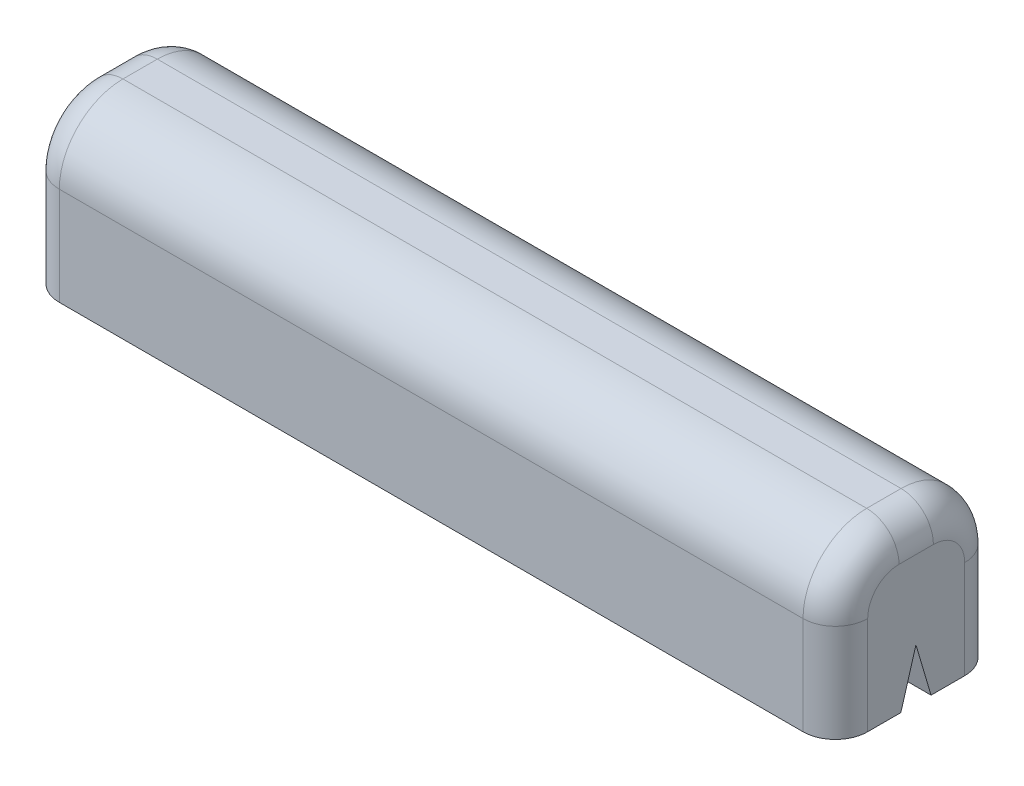
ISO-10303-21;
HEADER;
FILE_DESCRIPTION(('STEP AP214'),'2;1');
FILE_NAME('part.step','',(''),(''),'','','');
FILE_SCHEMA(('AUTOMOTIVE_DESIGN { 1 0 10303 214 1 1 1 1 }'));
ENDSEC;
DATA;
#1=APPLICATION_CONTEXT('core data for automotive mechanical design processes');
#2=APPLICATION_PROTOCOL_DEFINITION('international standard','automotive_design',2000,#1);
#3=PRODUCT_CONTEXT('',#1,'mechanical');
#4=PRODUCT('Part','Part','',(#3));
#5=PRODUCT_RELATED_PRODUCT_CATEGORY('part','',(#4));
#6=PRODUCT_DEFINITION_FORMATION('','',#4);
#7=PRODUCT_DEFINITION_CONTEXT('part definition',#1,'design');
#8=PRODUCT_DEFINITION('design','',#6,#7);
#9=PRODUCT_DEFINITION_SHAPE('','',#8);
#10=(LENGTH_UNIT() NAMED_UNIT(*) SI_UNIT(.MILLI.,.METRE.));
#11=(NAMED_UNIT(*) PLANE_ANGLE_UNIT() SI_UNIT($,.RADIAN.));
#12=(NAMED_UNIT(*) SI_UNIT($,.STERADIAN.) SOLID_ANGLE_UNIT());
#13=UNCERTAINTY_MEASURE_WITH_UNIT(LENGTH_MEASURE(1.E-05),#10,'distance_accuracy_value','');
#14=(GEOMETRIC_REPRESENTATION_CONTEXT(3) GLOBAL_UNCERTAINTY_ASSIGNED_CONTEXT((#13)) GLOBAL_UNIT_ASSIGNED_CONTEXT((#10,
#11,#12)) REPRESENTATION_CONTEXT('',''));
#15=CARTESIAN_POINT('',(0.,0.,0.));
#16=DIRECTION('',(0.,0.,1.));
#17=DIRECTION('',(1.,0.,0.));
#18=AXIS2_PLACEMENT_3D('',#15,#16,#17);
#19=CARTESIAN_POINT('',(127.,0.,0.));
#20=DIRECTION('',(0.,1.,0.));
#21=DIRECTION('',(0.,0.,1.));
#22=AXIS2_PLACEMENT_3D('',#19,#20,#21);
#23=PLANE('',#22);
#24=DIRECTION('',(0.,0.,-1.));
#25=VECTOR('',#24,1.);
#26=CARTESIAN_POINT('',(0.,0.,0.));
#27=LINE('',#26,#25);
#28=CARTESIAN_POINT('',(0.,0.,0.));
#29=VERTEX_POINT('',#28);
#30=CARTESIAN_POINT('',(0.,0.,-5.28298944818529));
#31=VERTEX_POINT('',#30);
#32=EDGE_CURVE('E193',#29,#31,#27,.T.);
#33=ORIENTED_EDGE('',*,*,#32,.T.);
#34=CARTESIAN_POINT('',(5.08,0.,-5.28298944818529));
#35=DIRECTION('',(0.,1.,0.));
#36=DIRECTION('',(0.,0.,1.));
#37=AXIS2_PLACEMENT_3D('',#34,#35,#36);
#38=CIRCLE('',#37,5.08);
#39=CARTESIAN_POINT('',(5.08,0.,-10.3629894481853));
#40=VERTEX_POINT('',#39);
#41=EDGE_CURVE('E268',#31,#40,#38,.F.);
#42=ORIENTED_EDGE('',*,*,#41,.T.);
#43=DIRECTION('',(-1.,0.,0.));
#44=VECTOR('',#43,1.);
#45=CARTESIAN_POINT('',(127.,0.,-10.3629894481853));
#46=LINE('',#45,#44);
#47=CARTESIAN_POINT('',(121.92,0.,-10.3629894481853));
#48=VERTEX_POINT('',#47);
#49=EDGE_CURVE('E213',#48,#40,#46,.T.);
#50=ORIENTED_EDGE('',*,*,#49,.F.);
#51=CARTESIAN_POINT('',(121.92,0.,-5.28298944818529));
#52=DIRECTION('',(0.,1.,0.));
#53=DIRECTION('',(0.,0.,1.));
#54=AXIS2_PLACEMENT_3D('',#51,#52,#53);
#55=CIRCLE('',#54,5.08);
#56=CARTESIAN_POINT('',(127.,0.,-5.28298944818529));
#57=VERTEX_POINT('',#56);
#58=EDGE_CURVE('E265',#48,#57,#55,.F.);
#59=ORIENTED_EDGE('',*,*,#58,.T.);
#60=DIRECTION('',(0.,0.,-1.));
#61=VECTOR('',#60,1.);
#62=CARTESIAN_POINT('',(127.,0.,0.));
#63=LINE('',#62,#61);
#64=CARTESIAN_POINT('',(127.,0.,0.));
#65=VERTEX_POINT('',#64);
#66=EDGE_CURVE('E168',#65,#57,#63,.T.);
#67=ORIENTED_EDGE('',*,*,#66,.F.);
#68=DIRECTION('',(-1.,0.,0.));
#69=VECTOR('',#68,1.);
#70=CARTESIAN_POINT('',(127.,0.,0.));
#71=LINE('',#70,#69);
#72=EDGE_CURVE('E189',#65,#29,#71,.T.);
#73=ORIENTED_EDGE('',*,*,#72,.T.);
#74=EDGE_LOOP('',(#33,#42,#50,#59,#67,#73));
#75=FACE_BOUND('',#74,.T.);
#76=ADVANCED_FACE('F47',(#75),#23,.F.);
#77=CARTESIAN_POINT('',(127.,25.4,-10.3629894481853));
#78=DIRECTION('',(0.,0.,1.));
#79=DIRECTION('',(1.,0.,0.));
#80=AXIS2_PLACEMENT_3D('',#77,#78,#79);
#81=PLANE('',#80);
#82=ORIENTED_EDGE('',*,*,#49,.T.);
#83=DIRECTION('',(0.,1.,0.));
#84=VECTOR('',#83,1.);
#85=CARTESIAN_POINT('',(5.08,15.399999934,-10.3629894481853));
#86=LINE('',#85,#84);
#87=CARTESIAN_POINT('',(5.08,15.399999934,-10.3629894481853));
#88=VERTEX_POINT('',#87);
#89=EDGE_CURVE('E262',#40,#88,#86,.T.);
#90=ORIENTED_EDGE('',*,*,#89,.T.);
#91=DIRECTION('',(-1.,0.,0.));
#92=VECTOR('',#91,1.);
#93=CARTESIAN_POINT('',(127.,15.399999934,-10.3629894481853));
#94=LINE('',#93,#92);
#95=CARTESIAN_POINT('',(121.92,15.399999934,-10.3629894481853));
#96=VERTEX_POINT('',#95);
#97=EDGE_CURVE('E227',#88,#96,#94,.F.);
#98=ORIENTED_EDGE('',*,*,#97,.T.);
#99=DIRECTION('',(0.,1.,0.));
#100=VECTOR('',#99,1.);
#101=CARTESIAN_POINT('',(121.92,25.4,-10.3629894481853));
#102=LINE('',#101,#100);
#103=EDGE_CURVE('E259',#96,#48,#102,.F.);
#104=ORIENTED_EDGE('',*,*,#103,.T.);
#105=EDGE_LOOP('',(#82,#90,#98,#104));
#106=FACE_BOUND('',#105,.T.);
#107=ADVANCED_FACE('F370',(#106),#81,.F.);
#108=CARTESIAN_POINT('',(127.,25.4,15.0370105518147));
#109=DIRECTION('',(0.,-1.,0.));
#110=DIRECTION('',(0.,0.,-1.));
#111=AXIS2_PLACEMENT_3D('',#108,#109,#110);
#112=PLANE('',#111);
#113=DIRECTION('',(-1.,0.,0.));
#114=VECTOR('',#113,1.);
#115=CARTESIAN_POINT('',(127.,25.4,-0.362989382185286));
#116=LINE('',#115,#114);
#117=CARTESIAN_POINT('',(121.92,25.4,-0.362989382185286));
#118=VERTEX_POINT('',#117);
#119=CARTESIAN_POINT('',(5.08,25.4,-0.362989382185286));
#120=VERTEX_POINT('',#119);
#121=EDGE_CURVE('E221',#118,#120,#116,.T.);
#122=ORIENTED_EDGE('',*,*,#121,.T.);
#123=DIRECTION('',(0.,0.,1.));
#124=VECTOR('',#123,1.);
#125=CARTESIAN_POINT('',(5.08,25.4,5.03701048581471));
#126=LINE('',#125,#124);
#127=CARTESIAN_POINT('',(5.08,25.4,5.03701048581471));
#128=VERTEX_POINT('',#127);
#129=EDGE_CURVE('E11',#120,#128,#126,.T.);
#130=ORIENTED_EDGE('',*,*,#129,.T.);
#131=DIRECTION('',(-1.,0.,0.));
#132=VECTOR('',#131,1.);
#133=CARTESIAN_POINT('',(127.,25.4,5.03701048581471));
#134=LINE('',#133,#132);
#135=CARTESIAN_POINT('',(121.92,25.4,5.03701048581471));
#136=VERTEX_POINT('',#135);
#137=EDGE_CURVE('E224',#128,#136,#134,.F.);
#138=ORIENTED_EDGE('',*,*,#137,.T.);
#139=DIRECTION('',(0.,0.,1.));
#140=VECTOR('',#139,1.);
#141=CARTESIAN_POINT('',(121.92,25.4,15.0370105518147));
#142=LINE('',#141,#140);
#143=EDGE_CURVE('E57',#136,#118,#142,.F.);
#144=ORIENTED_EDGE('',*,*,#143,.T.);
#145=EDGE_LOOP('',(#122,#130,#138,#144));
#146=FACE_BOUND('',#145,.T.);
#147=ADVANCED_FACE('F388',(#146),#112,.F.);
#148=CARTESIAN_POINT('',(127.,0.,15.0370105518147));
#149=DIRECTION('',(0.,0.,-1.));
#150=DIRECTION('',(0.,1.,0.));
#151=AXIS2_PLACEMENT_3D('',#148,#149,#150);
#152=PLANE('',#151);
#153=DIRECTION('',(-1.,0.,0.));
#154=VECTOR('',#153,1.);
#155=CARTESIAN_POINT('',(127.,15.399999934,15.0370105518147));
#156=LINE('',#155,#154);
#157=CARTESIAN_POINT('',(121.92,15.399999934,15.0370105518147));
#158=VERTEX_POINT('',#157);
#159=CARTESIAN_POINT('',(5.08,15.399999934,15.0370105518147));
#160=VERTEX_POINT('',#159);
#161=EDGE_CURVE('E217',#158,#160,#156,.T.);
#162=ORIENTED_EDGE('',*,*,#161,.T.);
#163=DIRECTION('',(0.,-1.,0.));
#164=VECTOR('',#163,1.);
#165=CARTESIAN_POINT('',(5.08,0.,15.0370105518147));
#166=LINE('',#165,#164);
#167=CARTESIAN_POINT('',(5.08,0.,15.0370105518147));
#168=VERTEX_POINT('',#167);
#169=EDGE_CURVE('E234',#160,#168,#166,.T.);
#170=ORIENTED_EDGE('',*,*,#169,.T.);
#171=DIRECTION('',(-1.,0.,0.));
#172=VECTOR('',#171,1.);
#173=CARTESIAN_POINT('',(127.,0.,15.0370105518147));
#174=LINE('',#173,#172);
#175=CARTESIAN_POINT('',(121.92,0.,15.0370105518147));
#176=VERTEX_POINT('',#175);
#177=EDGE_CURVE('E179',#176,#168,#174,.T.);
#178=ORIENTED_EDGE('',*,*,#177,.F.);
#179=DIRECTION('',(0.,-1.,0.));
#180=VECTOR('',#179,1.);
#181=CARTESIAN_POINT('',(121.92,0.,15.0370105518147));
#182=LINE('',#181,#180);
#183=EDGE_CURVE('E231',#176,#158,#182,.F.);
#184=ORIENTED_EDGE('',*,*,#183,.T.);
#185=EDGE_LOOP('',(#162,#170,#178,#184));
#186=FACE_BOUND('',#185,.T.);
#187=ADVANCED_FACE('F337',(#186),#152,.F.);
#188=CARTESIAN_POINT('',(127.,0.,4.75001055181471));
#189=DIRECTION('',(0.,1.,0.));
#190=DIRECTION('',(0.,0.,1.));
#191=AXIS2_PLACEMENT_3D('',#188,#189,#190);
#192=PLANE('',#191);
#193=ORIENTED_EDGE('',*,*,#177,.T.);
#194=CARTESIAN_POINT('',(5.08,0.,9.95701055181471));
#195=DIRECTION('',(0.,1.,0.));
#196=DIRECTION('',(0.,0.,1.));
#197=AXIS2_PLACEMENT_3D('',#194,#195,#196);
#198=CIRCLE('',#197,5.08);
#199=CARTESIAN_POINT('',(0.,0.,9.95701055181471));
#200=VERTEX_POINT('',#199);
#201=EDGE_CURVE('E241',#168,#200,#198,.F.);
#202=ORIENTED_EDGE('',*,*,#201,.T.);
#203=DIRECTION('',(0.,0.,-1.));
#204=VECTOR('',#203,1.);
#205=CARTESIAN_POINT('',(0.,0.,4.75001055181471));
#206=LINE('',#205,#204);
#207=CARTESIAN_POINT('',(0.,0.,4.75001055181471));
#208=VERTEX_POINT('',#207);
#209=EDGE_CURVE('E175',#200,#208,#206,.T.);
#210=ORIENTED_EDGE('',*,*,#209,.T.);
#211=DIRECTION('',(-1.,0.,0.));
#212=VECTOR('',#211,1.);
#213=CARTESIAN_POINT('',(127.,0.,4.75001055181471));
#214=LINE('',#213,#212);
#215=CARTESIAN_POINT('',(127.,0.,4.75001055181471));
#216=VERTEX_POINT('',#215);
#217=EDGE_CURVE('E171',#216,#208,#214,.T.);
#218=ORIENTED_EDGE('',*,*,#217,.F.);
#219=DIRECTION('',(0.,0.,-1.));
#220=VECTOR('',#219,1.);
#221=CARTESIAN_POINT('',(127.,0.,4.75001055181471));
#222=LINE('',#221,#220);
#223=CARTESIAN_POINT('',(127.,0.,9.95701055181471));
#224=VERTEX_POINT('',#223);
#225=EDGE_CURVE('E156',#224,#216,#222,.T.);
#226=ORIENTED_EDGE('',*,*,#225,.F.);
#227=CARTESIAN_POINT('',(121.92,0.,9.95701055181471));
#228=DIRECTION('',(0.,1.,0.));
#229=DIRECTION('',(0.,0.,1.));
#230=AXIS2_PLACEMENT_3D('',#227,#228,#229);
#231=CIRCLE('',#230,5.08);
#232=EDGE_CURVE('E238',#224,#176,#231,.F.);
#233=ORIENTED_EDGE('',*,*,#232,.T.);
#234=EDGE_LOOP('',(#193,#202,#210,#218,#226,#233));
#235=FACE_BOUND('',#234,.T.);
#236=ADVANCED_FACE('F173',(#235),#192,.F.);
#237=CARTESIAN_POINT('',(127.,0.,4.75001055181471));
#238=DIRECTION('',(0.,0.283345893093218,0.959017781309193));
#239=DIRECTION('',(0.,-0.959017781309193,0.283345893093218));
#240=AXIS2_PLACEMENT_3D('',#237,#238,#239);
#241=PLANE('',#240);
#242=DIRECTION('',(0.,0.959017781309193,-0.283345893093218));
#243=VECTOR('',#242,1.);
#244=CARTESIAN_POINT('',(0.,0.,4.75001055181471));
#245=LINE('',#244,#243);
#246=CARTESIAN_POINT('',(0.,8.03848704293365,2.37500527590736));
#247=VERTEX_POINT('',#246);
#248=EDGE_CURVE('E200',#208,#247,#245,.T.);
#249=ORIENTED_EDGE('',*,*,#248,.T.);
#250=DIRECTION('',(-1.,0.,0.));
#251=VECTOR('',#250,1.);
#252=CARTESIAN_POINT('',(127.,8.03848704293365,2.37500527590736));
#253=LINE('',#252,#251);
#254=CARTESIAN_POINT('',(127.,8.03848704293365,2.37500527590736));
#255=VERTEX_POINT('',#254);
#256=EDGE_CURVE('E180',#255,#247,#253,.T.);
#257=ORIENTED_EDGE('',*,*,#256,.F.);
#258=DIRECTION('',(0.,0.959017781309193,-0.283345893093218));
#259=VECTOR('',#258,1.);
#260=CARTESIAN_POINT('',(127.,0.,4.75001055181471));
#261=LINE('',#260,#259);
#262=EDGE_CURVE('E161',#216,#255,#261,.T.);
#263=ORIENTED_EDGE('',*,*,#262,.F.);
#264=ORIENTED_EDGE('',*,*,#217,.T.);
#265=EDGE_LOOP('',(#249,#257,#263,#264));
#266=FACE_BOUND('',#265,.T.);
#267=ADVANCED_FACE('F182',(#266),#241,.F.);
#268=CARTESIAN_POINT('',(127.,8.03848704293365,2.37500527590736));
#269=DIRECTION('',(0.,0.283345893093219,-0.959017781309192));
#270=DIRECTION('',(0.,0.959017781309193,0.283345893093219));
#271=AXIS2_PLACEMENT_3D('',#268,#269,#270);
#272=PLANE('',#271);
#273=DIRECTION('',(0.,-0.959017781309193,-0.283345893093219));
#274=VECTOR('',#273,1.);
#275=CARTESIAN_POINT('',(0.,8.03848704293365,2.37500527590736));
#276=LINE('',#275,#274);
#277=EDGE_CURVE('E203',#247,#29,#276,.T.);
#278=ORIENTED_EDGE('',*,*,#277,.T.);
#279=ORIENTED_EDGE('',*,*,#72,.F.);
#280=DIRECTION('',(0.,-0.959017781309193,-0.283345893093219));
#281=VECTOR('',#280,1.);
#282=CARTESIAN_POINT('',(127.,8.03848704293365,2.37500527590736));
#283=LINE('',#282,#281);
#284=EDGE_CURVE('E186',#255,#65,#283,.T.);
#285=ORIENTED_EDGE('',*,*,#284,.F.);
#286=ORIENTED_EDGE('',*,*,#256,.T.);
#287=EDGE_LOOP('',(#278,#279,#285,#286));
#288=FACE_BOUND('',#287,.T.);
#289=ADVANCED_FACE('F350',(#288),#272,.F.);
#290=CARTESIAN_POINT('',(127.,0.,0.));
#291=DIRECTION('',(-1.,0.,0.));
#292=DIRECTION('',(0.,0.,1.));
#293=AXIS2_PLACEMENT_3D('',#290,#291,#292);
#294=PLANE('',#293);
#295=ORIENTED_EDGE('',*,*,#66,.T.);
#296=DIRECTION('',(0.,1.,0.));
#297=VECTOR('',#296,1.);
#298=CARTESIAN_POINT('',(127.,0.,-5.28298944818529));
#299=LINE('',#298,#297);
#300=CARTESIAN_POINT('',(127.,15.399999934,-5.28298944818529));
#301=VERTEX_POINT('',#300);
#302=EDGE_CURVE('E282',#57,#301,#299,.T.);
#303=ORIENTED_EDGE('',*,*,#302,.T.);
#304=CARTESIAN_POINT('',(127.,15.399999934,-0.362989382185284));
#305=DIRECTION('',(-1.,0.,0.));
#306=DIRECTION('',(0.,0.,1.));
#307=AXIS2_PLACEMENT_3D('',#304,#305,#306);
#308=CIRCLE('',#307,4.920000066);
#309=CARTESIAN_POINT('',(127.,20.32,-0.362989382185285));
#310=VERTEX_POINT('',#309);
#311=EDGE_CURVE('E274',#301,#310,#308,.F.);
#312=ORIENTED_EDGE('',*,*,#311,.T.);
#313=DIRECTION('',(0.,0.,1.));
#314=VECTOR('',#313,1.);
#315=CARTESIAN_POINT('',(127.,20.32,0.));
#316=LINE('',#315,#314);
#317=CARTESIAN_POINT('',(127.,20.32,5.03701048581471));
#318=VERTEX_POINT('',#317);
#319=EDGE_CURVE('E271',#310,#318,#316,.T.);
#320=ORIENTED_EDGE('',*,*,#319,.T.);
#321=CARTESIAN_POINT('',(127.,15.399999934,5.03701048581471));
#322=DIRECTION('',(-1.,0.,0.));
#323=DIRECTION('',(0.,0.,1.));
#324=AXIS2_PLACEMENT_3D('',#321,#322,#323);
#325=CIRCLE('',#324,4.920000066);
#326=CARTESIAN_POINT('',(127.,15.399999934,9.95701055181471));
#327=VERTEX_POINT('',#326);
#328=EDGE_CURVE('E277',#318,#327,#325,.F.);
#329=ORIENTED_EDGE('',*,*,#328,.T.);
#330=DIRECTION('',(0.,-1.,0.));
#331=VECTOR('',#330,1.);
#332=CARTESIAN_POINT('',(127.,0.,9.95701055181471));
#333=LINE('',#332,#331);
#334=EDGE_CURVE('E164',#327,#224,#333,.T.);
#335=ORIENTED_EDGE('',*,*,#334,.T.);
#336=ORIENTED_EDGE('',*,*,#225,.T.);
#337=ORIENTED_EDGE('',*,*,#262,.T.);
#338=ORIENTED_EDGE('',*,*,#284,.T.);
#339=EDGE_LOOP('',(#295,#303,#312,#320,#329,#335,#336,#337,#338));
#340=FACE_BOUND('',#339,.T.);
#341=ADVANCED_FACE('F159',(#340),#294,.F.);
#342=CARTESIAN_POINT('',(0.,0.,0.));
#343=DIRECTION('',(-1.,0.,0.));
#344=DIRECTION('',(0.,0.,1.));
#345=AXIS2_PLACEMENT_3D('',#342,#343,#344);
#346=PLANE('',#345);
#347=ORIENTED_EDGE('',*,*,#209,.F.);
#348=DIRECTION('',(0.,-1.,0.));
#349=VECTOR('',#348,1.);
#350=CARTESIAN_POINT('',(0.,15.399999934,9.95701055181471));
#351=LINE('',#350,#349);
#352=CARTESIAN_POINT('',(0.,15.399999934,9.95701055181471));
#353=VERTEX_POINT('',#352);
#354=EDGE_CURVE('E256',#200,#353,#351,.F.);
#355=ORIENTED_EDGE('',*,*,#354,.T.);
#356=CARTESIAN_POINT('',(0.,15.399999934,5.03701048581471));
#357=DIRECTION('',(-1.,0.,0.));
#358=DIRECTION('',(0.,0.,1.));
#359=AXIS2_PLACEMENT_3D('',#356,#357,#358);
#360=CIRCLE('',#359,4.920000066);
#361=CARTESIAN_POINT('',(0.,20.32,5.03701048581471));
#362=VERTEX_POINT('',#361);
#363=EDGE_CURVE('E244',#353,#362,#360,.T.);
#364=ORIENTED_EDGE('',*,*,#363,.T.);
#365=DIRECTION('',(0.,0.,1.));
#366=VECTOR('',#365,1.);
#367=CARTESIAN_POINT('',(0.,20.32,-0.362989382185286));
#368=LINE('',#367,#366);
#369=CARTESIAN_POINT('',(0.,20.32,-0.362989382185285));
#370=VERTEX_POINT('',#369);
#371=EDGE_CURVE('E247',#362,#370,#368,.F.);
#372=ORIENTED_EDGE('',*,*,#371,.T.);
#373=CARTESIAN_POINT('',(0.,15.399999934,-0.362989382185284));
#374=DIRECTION('',(-1.,0.,0.));
#375=DIRECTION('',(0.,0.,1.));
#376=AXIS2_PLACEMENT_3D('',#373,#374,#375);
#377=CIRCLE('',#376,4.920000066);
#378=CARTESIAN_POINT('',(0.,15.399999934,-5.28298944818529));
#379=VERTEX_POINT('',#378);
#380=EDGE_CURVE('E250',#370,#379,#377,.T.);
#381=ORIENTED_EDGE('',*,*,#380,.T.);
#382=DIRECTION('',(0.,1.,0.));
#383=VECTOR('',#382,1.);
#384=CARTESIAN_POINT('',(0.,0.,-5.28298944818529));
#385=LINE('',#384,#383);
#386=EDGE_CURVE('E253',#379,#31,#385,.F.);
#387=ORIENTED_EDGE('',*,*,#386,.T.);
#388=ORIENTED_EDGE('',*,*,#32,.F.);
#389=ORIENTED_EDGE('',*,*,#277,.F.);
#390=ORIENTED_EDGE('',*,*,#248,.F.);
#391=EDGE_LOOP('',(#347,#355,#364,#372,#381,#387,#388,#389,#390));
#392=FACE_BOUND('',#391,.T.);
#393=ADVANCED_FACE('F345',(#392),#346,.T.);
#394=CARTESIAN_POINT('',(127.,15.399999934,5.03701048581471));
#395=DIRECTION('',(-1.,0.,0.));
#396=DIRECTION('',(0.,0.,1.));
#397=AXIS2_PLACEMENT_3D('',#394,#395,#396);
#398=CYLINDRICAL_SURFACE('',#397,10.000000066);
#399=ORIENTED_EDGE('',*,*,#161,.F.);
#400=CARTESIAN_POINT('',(121.92,15.399999934,5.03701048581471));
#401=DIRECTION('',(-1.,0.,0.));
#402=DIRECTION('',(0.,0.,1.));
#403=AXIS2_PLACEMENT_3D('',#400,#401,#402);
#404=CIRCLE('',#403,10.000000066);
#405=EDGE_CURVE('E289',#158,#136,#404,.T.);
#406=ORIENTED_EDGE('',*,*,#405,.T.);
#407=ORIENTED_EDGE('',*,*,#137,.F.);
#408=CARTESIAN_POINT('',(5.08,15.399999934,5.03701048581471));
#409=DIRECTION('',(-1.,0.,0.));
#410=DIRECTION('',(0.,0.,1.));
#411=AXIS2_PLACEMENT_3D('',#408,#409,#410);
#412=CIRCLE('',#411,10.000000066);
#413=EDGE_CURVE('E286',#128,#160,#412,.F.);
#414=ORIENTED_EDGE('',*,*,#413,.T.);
#415=EDGE_LOOP('',(#399,#406,#407,#414));
#416=FACE_BOUND('',#415,.T.);
#417=ADVANCED_FACE('F390',(#416),#398,.T.);
#418=CARTESIAN_POINT('',(127.,15.399999934,-0.362989382185284));
#419=DIRECTION('',(-1.,0.,0.));
#420=DIRECTION('',(0.,0.,1.));
#421=AXIS2_PLACEMENT_3D('',#418,#419,#420);
#422=CYLINDRICAL_SURFACE('',#421,10.000000066);
#423=ORIENTED_EDGE('',*,*,#97,.F.);
#424=CARTESIAN_POINT('',(5.08,15.399999934,-0.362989382185284));
#425=DIRECTION('',(-1.,0.,0.));
#426=DIRECTION('',(0.,0.,1.));
#427=AXIS2_PLACEMENT_3D('',#424,#425,#426);
#428=CIRCLE('',#427,10.000000066);
#429=EDGE_CURVE('E65',#88,#120,#428,.F.);
#430=ORIENTED_EDGE('',*,*,#429,.T.);
#431=ORIENTED_EDGE('',*,*,#121,.F.);
#432=CARTESIAN_POINT('',(121.92,15.399999934,-0.362989382185284));
#433=DIRECTION('',(-1.,0.,0.));
#434=DIRECTION('',(0.,0.,1.));
#435=AXIS2_PLACEMENT_3D('',#432,#433,#434);
#436=CIRCLE('',#435,10.000000066);
#437=EDGE_CURVE('E292',#118,#96,#436,.T.);
#438=ORIENTED_EDGE('',*,*,#437,.T.);
#439=EDGE_LOOP('',(#423,#430,#431,#438));
#440=FACE_BOUND('',#439,.T.);
#441=ADVANCED_FACE('F367',(#440),#422,.T.);
#442=CARTESIAN_POINT('',(5.08,25.4,-5.28298944818529));
#443=DIRECTION('',(0.,-1.,0.));
#444=DIRECTION('',(0.,0.,-1.));
#445=AXIS2_PLACEMENT_3D('',#442,#443,#444);
#446=CYLINDRICAL_SURFACE('',#445,5.08);
#447=ORIENTED_EDGE('',*,*,#41,.F.);
#448=ORIENTED_EDGE('',*,*,#386,.F.);
#449=CARTESIAN_POINT('',(5.08,15.399999934,-5.28298944818529));
#450=DIRECTION('',(0.,1.,0.));
#451=DIRECTION('',(0.,0.,1.));
#452=AXIS2_PLACEMENT_3D('',#449,#450,#451);
#453=CIRCLE('',#452,5.08);
#454=EDGE_CURVE('E197',#88,#379,#453,.T.);
#455=ORIENTED_EDGE('',*,*,#454,.F.);
#456=ORIENTED_EDGE('',*,*,#89,.F.);
#457=EDGE_LOOP('',(#447,#448,#455,#456));
#458=FACE_BOUND('',#457,.T.);
#459=ADVANCED_FACE('F375',(#458),#446,.T.);
#460=CARTESIAN_POINT('',(5.08,15.399999934,-0.362989382185284));
#461=DIRECTION('',(-1.,0.,0.));
#462=DIRECTION('',(0.,0.,1.));
#463=AXIS2_PLACEMENT_3D('',#460,#461,#462);
#464=DEGENERATE_TOROIDAL_SURFACE('',#463,4.920000066,5.08,.T.);
#465=ORIENTED_EDGE('',*,*,#454,.T.);
#466=ORIENTED_EDGE('',*,*,#380,.F.);
#467=CARTESIAN_POINT('',(5.08,20.32,-0.362989382185285));
#468=DIRECTION('',(0.,0.,1.));
#469=DIRECTION('',(0.,-1.,0.));
#470=AXIS2_PLACEMENT_3D('',#467,#468,#469);
#471=CIRCLE('',#470,5.08);
#472=EDGE_CURVE('E307',#120,#370,#471,.T.);
#473=ORIENTED_EDGE('',*,*,#472,.F.);
#474=ORIENTED_EDGE('',*,*,#429,.F.);
#475=EDGE_LOOP('',(#465,#466,#473,#474));
#476=FACE_BOUND('',#475,.T.);
#477=ADVANCED_FACE('F380',(#476),#464,.T.);
#478=CARTESIAN_POINT('',(5.08,20.32,15.0370105518147));
#479=DIRECTION('',(0.,0.,-1.));
#480=DIRECTION('',(0.,1.,0.));
#481=AXIS2_PLACEMENT_3D('',#478,#479,#480);
#482=CYLINDRICAL_SURFACE('',#481,5.08);
#483=ORIENTED_EDGE('',*,*,#472,.T.);
#484=ORIENTED_EDGE('',*,*,#371,.F.);
#485=CARTESIAN_POINT('',(5.08,20.32,5.03701048581471));
#486=DIRECTION('',(0.,0.,1.));
#487=DIRECTION('',(0.,-1.,0.));
#488=AXIS2_PLACEMENT_3D('',#485,#486,#487);
#489=CIRCLE('',#488,5.08);
#490=EDGE_CURVE('E303',#128,#362,#489,.T.);
#491=ORIENTED_EDGE('',*,*,#490,.F.);
#492=ORIENTED_EDGE('',*,*,#129,.F.);
#493=EDGE_LOOP('',(#483,#484,#491,#492));
#494=FACE_BOUND('',#493,.T.);
#495=ADVANCED_FACE('F385',(#494),#482,.T.);
#496=CARTESIAN_POINT('',(5.08,15.399999934,5.03701048581471));
#497=DIRECTION('',(-1.,0.,0.));
#498=DIRECTION('',(0.,0.,1.));
#499=AXIS2_PLACEMENT_3D('',#496,#497,#498);
#500=DEGENERATE_TOROIDAL_SURFACE('',#499,4.920000066,5.08,.T.);
#501=ORIENTED_EDGE('',*,*,#490,.T.);
#502=ORIENTED_EDGE('',*,*,#363,.F.);
#503=CARTESIAN_POINT('',(5.08,15.399999934,9.95701055181471));
#504=DIRECTION('',(0.,-1.,0.));
#505=DIRECTION('',(0.,0.,-1.));
#506=AXIS2_PLACEMENT_3D('',#503,#504,#505);
#507=CIRCLE('',#506,5.08);
#508=EDGE_CURVE('E299',#160,#353,#507,.T.);
#509=ORIENTED_EDGE('',*,*,#508,.F.);
#510=ORIENTED_EDGE('',*,*,#413,.F.);
#511=EDGE_LOOP('',(#501,#502,#509,#510));
#512=FACE_BOUND('',#511,.T.);
#513=ADVANCED_FACE('F392',(#512),#500,.T.);
#514=CARTESIAN_POINT('',(5.08,0.,9.95701055181471));
#515=DIRECTION('',(0.,1.,0.));
#516=DIRECTION('',(0.,0.,1.));
#517=AXIS2_PLACEMENT_3D('',#514,#515,#516);
#518=CYLINDRICAL_SURFACE('',#517,5.08);
#519=ORIENTED_EDGE('',*,*,#508,.T.);
#520=ORIENTED_EDGE('',*,*,#354,.F.);
#521=ORIENTED_EDGE('',*,*,#201,.F.);
#522=ORIENTED_EDGE('',*,*,#169,.F.);
#523=EDGE_LOOP('',(#519,#520,#521,#522));
#524=FACE_BOUND('',#523,.T.);
#525=ADVANCED_FACE('F342',(#524),#518,.T.);
#526=CARTESIAN_POINT('',(121.92,0.,9.95701055181471));
#527=DIRECTION('',(0.,-1.,0.));
#528=DIRECTION('',(0.,0.,-1.));
#529=AXIS2_PLACEMENT_3D('',#526,#527,#528);
#530=CYLINDRICAL_SURFACE('',#529,5.08);
#531=ORIENTED_EDGE('',*,*,#232,.F.);
#532=ORIENTED_EDGE('',*,*,#334,.F.);
#533=CARTESIAN_POINT('',(121.92,15.399999934,9.95701055181471));
#534=DIRECTION('',(0.,1.,0.));
#535=DIRECTION('',(0.,0.,1.));
#536=AXIS2_PLACEMENT_3D('',#533,#534,#535);
#537=CIRCLE('',#536,5.08);
#538=EDGE_CURVE('E51',#158,#327,#537,.T.);
#539=ORIENTED_EDGE('',*,*,#538,.F.);
#540=ORIENTED_EDGE('',*,*,#183,.F.);
#541=EDGE_LOOP('',(#531,#532,#539,#540));
#542=FACE_BOUND('',#541,.T.);
#543=ADVANCED_FACE('F49',(#542),#530,.T.);
#544=CARTESIAN_POINT('',(121.92,15.399999934,5.03701048581471));
#545=DIRECTION('',(-1.,0.,0.));
#546=DIRECTION('',(0.,0.,1.));
#547=AXIS2_PLACEMENT_3D('',#544,#545,#546);
#548=DEGENERATE_TOROIDAL_SURFACE('',#547,4.920000066,5.08,.T.);
#549=ORIENTED_EDGE('',*,*,#538,.T.);
#550=ORIENTED_EDGE('',*,*,#328,.F.);
#551=CARTESIAN_POINT('',(121.92,20.32,5.03701048581471));
#552=DIRECTION('',(0.,0.,-1.));
#553=DIRECTION('',(0.,1.,0.));
#554=AXIS2_PLACEMENT_3D('',#551,#552,#553);
#555=CIRCLE('',#554,5.08);
#556=EDGE_CURVE('E320',#136,#318,#555,.T.);
#557=ORIENTED_EDGE('',*,*,#556,.F.);
#558=ORIENTED_EDGE('',*,*,#405,.F.);
#559=EDGE_LOOP('',(#549,#550,#557,#558));
#560=FACE_BOUND('',#559,.T.);
#561=ADVANCED_FACE('F332',(#560),#548,.T.);
#562=CARTESIAN_POINT('',(121.92,20.32,0.));
#563=DIRECTION('',(0.,0.,1.));
#564=DIRECTION('',(0.,-1.,0.));
#565=AXIS2_PLACEMENT_3D('',#562,#563,#564);
#566=CYLINDRICAL_SURFACE('',#565,5.08);
#567=ORIENTED_EDGE('',*,*,#556,.T.);
#568=ORIENTED_EDGE('',*,*,#319,.F.);
#569=CARTESIAN_POINT('',(121.92,20.32,-0.362989382185286));
#570=DIRECTION('',(0.,0.,-1.));
#571=DIRECTION('',(0.,1.,0.));
#572=AXIS2_PLACEMENT_3D('',#569,#570,#571);
#573=CIRCLE('',#572,5.08);
#574=EDGE_CURVE('E317',#118,#310,#573,.T.);
#575=ORIENTED_EDGE('',*,*,#574,.F.);
#576=ORIENTED_EDGE('',*,*,#143,.F.);
#577=EDGE_LOOP('',(#567,#568,#575,#576));
#578=FACE_BOUND('',#577,.T.);
#579=ADVANCED_FACE('F366',(#578),#566,.T.);
#580=CARTESIAN_POINT('',(121.92,15.399999934,-0.362989382185284));
#581=DIRECTION('',(-1.,0.,0.));
#582=DIRECTION('',(0.,0.,1.));
#583=AXIS2_PLACEMENT_3D('',#580,#581,#582);
#584=DEGENERATE_TOROIDAL_SURFACE('',#583,4.920000066,5.08,.T.);
#585=ORIENTED_EDGE('',*,*,#574,.T.);
#586=ORIENTED_EDGE('',*,*,#311,.F.);
#587=CARTESIAN_POINT('',(121.92,15.399999934,-5.28298944818529));
#588=DIRECTION('',(0.,-1.,0.));
#589=DIRECTION('',(0.,0.,-1.));
#590=AXIS2_PLACEMENT_3D('',#587,#588,#589);
#591=CIRCLE('',#590,5.08);
#592=EDGE_CURVE('E314',#96,#301,#591,.T.);
#593=ORIENTED_EDGE('',*,*,#592,.F.);
#594=ORIENTED_EDGE('',*,*,#437,.F.);
#595=EDGE_LOOP('',(#585,#586,#593,#594));
#596=FACE_BOUND('',#595,.T.);
#597=ADVANCED_FACE('F364',(#596),#584,.T.);
#598=CARTESIAN_POINT('',(121.92,0.,-5.28298944818529));
#599=DIRECTION('',(0.,1.,0.));
#600=DIRECTION('',(0.,0.,1.));
#601=AXIS2_PLACEMENT_3D('',#598,#599,#600);
#602=CYLINDRICAL_SURFACE('',#601,5.08);
#603=ORIENTED_EDGE('',*,*,#58,.F.);
#604=ORIENTED_EDGE('',*,*,#103,.F.);
#605=ORIENTED_EDGE('',*,*,#592,.T.);
#606=ORIENTED_EDGE('',*,*,#302,.F.);
#607=EDGE_LOOP('',(#603,#604,#605,#606));
#608=FACE_BOUND('',#607,.T.);
#609=ADVANCED_FACE('F358',(#608),#602,.T.);
#610=CLOSED_SHELL('',(#76,#107,#147,#187,#236,#267,#289,#341,#393,#417,#441,#459,#477,#495,#513,
#525,#543,#561,#579,#597,#609));
#611=MANIFOLD_SOLID_BREP('B2',#610);
#612=ADVANCED_BREP_SHAPE_REPRESENTATION('',(#18,#611),#14);
#613=SHAPE_DEFINITION_REPRESENTATION(#9,#612);
ENDSEC;
END-ISO-10303-21;
